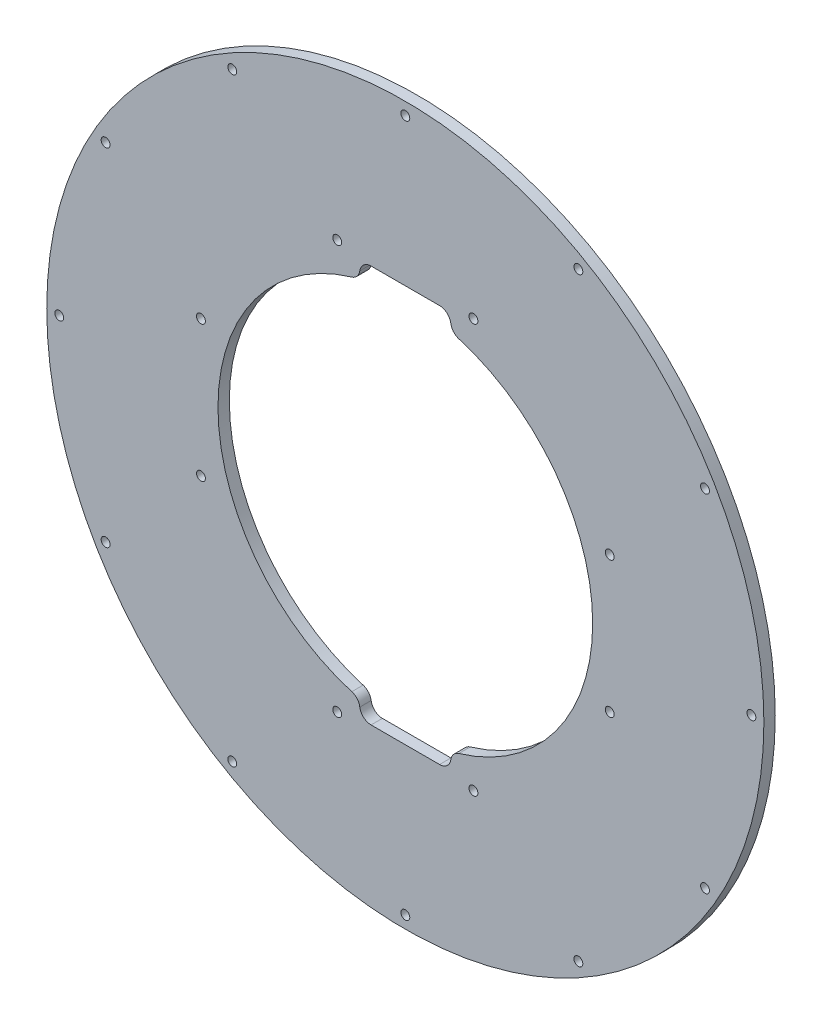
ISO-10303-21;
HEADER;
FILE_DESCRIPTION(('STEP AP214'),'2;1');
FILE_NAME('part.step','',(''),(''),'','','');
FILE_SCHEMA(('AUTOMOTIVE_DESIGN { 1 0 10303 214 1 1 1 1 }'));
ENDSEC;
DATA;
#1=APPLICATION_CONTEXT('core data for automotive mechanical design processes');
#2=APPLICATION_PROTOCOL_DEFINITION('international standard','automotive_design',2000,#1);
#3=PRODUCT_CONTEXT('',#1,'mechanical');
#4=PRODUCT('Part','Part','',(#3));
#5=PRODUCT_RELATED_PRODUCT_CATEGORY('part','',(#4));
#6=PRODUCT_DEFINITION_FORMATION('','',#4);
#7=PRODUCT_DEFINITION_CONTEXT('part definition',#1,'design');
#8=PRODUCT_DEFINITION('design','',#6,#7);
#9=PRODUCT_DEFINITION_SHAPE('','',#8);
#10=(LENGTH_UNIT() NAMED_UNIT(*) SI_UNIT(.MILLI.,.METRE.));
#11=(NAMED_UNIT(*) PLANE_ANGLE_UNIT() SI_UNIT($,.RADIAN.));
#12=(NAMED_UNIT(*) SI_UNIT($,.STERADIAN.) SOLID_ANGLE_UNIT());
#13=UNCERTAINTY_MEASURE_WITH_UNIT(LENGTH_MEASURE(1.E-05),#10,'distance_accuracy_value','');
#14=(GEOMETRIC_REPRESENTATION_CONTEXT(3) GLOBAL_UNCERTAINTY_ASSIGNED_CONTEXT((#13)) GLOBAL_UNIT_ASSIGNED_CONTEXT((#10,
#11,#12)) REPRESENTATION_CONTEXT('',''));
#15=CARTESIAN_POINT('',(0.,0.,0.));
#16=DIRECTION('',(0.,0.,1.));
#17=DIRECTION('',(1.,0.,0.));
#18=AXIS2_PLACEMENT_3D('',#15,#16,#17);
#19=CARTESIAN_POINT('',(0.,0.,6.35));
#20=DIRECTION('',(0.,0.,-1.));
#21=DIRECTION('',(-1.,0.,0.));
#22=AXIS2_PLACEMENT_3D('',#19,#20,#21);
#23=CYLINDRICAL_SURFACE('',#22,104.775);
#24=CARTESIAN_POINT('',(0.,0.,0.));
#25=DIRECTION('',(0.,0.,1.));
#26=DIRECTION('',(1.,0.,0.));
#27=AXIS2_PLACEMENT_3D('',#24,#25,#26);
#28=CIRCLE('',#27,104.775);
#29=CARTESIAN_POINT('',(29.9357142857136,-100.407438146803,0.));
#30=VERTEX_POINT('',#29);
#31=CARTESIAN_POINT('',(29.9357142857143,100.407438146803,0.));
#32=VERTEX_POINT('',#31);
#33=EDGE_CURVE('E139',#30,#32,#28,.T.);
#34=ORIENTED_EDGE('',*,*,#33,.F.);
#35=DIRECTION('',(0.,0.,-1.));
#36=VECTOR('',#35,1.);
#37=CARTESIAN_POINT('',(29.9357142857136,-100.407438146803,6.35));
#38=LINE('',#37,#36);
#39=CARTESIAN_POINT('',(29.9357142857136,-100.407438146803,6.35));
#40=VERTEX_POINT('',#39);
#41=EDGE_CURVE('E134',#30,#40,#38,.F.);
#42=ORIENTED_EDGE('',*,*,#41,.T.);
#43=CARTESIAN_POINT('',(0.,0.,6.35));
#44=DIRECTION('',(0.,0.,1.));
#45=DIRECTION('',(1.,0.,0.));
#46=AXIS2_PLACEMENT_3D('',#43,#44,#45);
#47=CIRCLE('',#46,104.775);
#48=CARTESIAN_POINT('',(29.9357142857143,100.407438146803,6.35));
#49=VERTEX_POINT('',#48);
#50=EDGE_CURVE('E136',#40,#49,#47,.T.);
#51=ORIENTED_EDGE('',*,*,#50,.T.);
#52=DIRECTION('',(0.,0.,-1.));
#53=VECTOR('',#52,1.);
#54=CARTESIAN_POINT('',(29.9357142857143,100.407438146803,6.35));
#55=LINE('',#54,#53);
#56=EDGE_CURVE('E145',#49,#32,#55,.T.);
#57=ORIENTED_EDGE('',*,*,#56,.T.);
#58=EDGE_LOOP('',(#34,#42,#51,#57));
#59=FACE_BOUND('',#58,.T.);
#60=ADVANCED_FACE('F44',(#59),#23,.F.);
#61=CARTESIAN_POINT('',(0.,0.,6.35));
#62=DIRECTION('',(0.,0.,1.));
#63=DIRECTION('',(1.,0.,0.));
#64=AXIS2_PLACEMENT_3D('',#61,#62,#63);
#65=PLANE('',#64);
#66=CARTESIAN_POINT('',(-114.3,38.1000000000012,6.35));
#67=DIRECTION('',(0.,0.,1.));
#68=DIRECTION('',(1.,0.,0.));
#69=AXIS2_PLACEMENT_3D('',#66,#67,#68);
#70=CIRCLE('',#69,2.48919999999998);
#71=CARTESIAN_POINT('',(-111.8108,38.1000000000012,6.35));
#72=VERTEX_POINT('',#71);
#73=EDGE_CURVE('E759',#72,#72,#70,.T.);
#74=ORIENTED_EDGE('',*,*,#73,.F.);
#75=EDGE_LOOP('',(#74));
#76=FACE_BOUND('',#75,.T.);
#77=CARTESIAN_POINT('',(-114.3,-38.0999999999988,6.35));
#78=DIRECTION('',(0.,0.,1.));
#79=DIRECTION('',(1.,0.,0.));
#80=AXIS2_PLACEMENT_3D('',#77,#78,#79);
#81=CIRCLE('',#80,2.48919999999998);
#82=CARTESIAN_POINT('',(-111.8108,-38.0999999999988,6.35));
#83=VERTEX_POINT('',#82);
#84=EDGE_CURVE('E752',#83,#83,#81,.T.);
#85=ORIENTED_EDGE('',*,*,#84,.F.);
#86=EDGE_LOOP('',(#85));
#87=FACE_BOUND('',#86,.T.);
#88=CARTESIAN_POINT('',(-38.1000000000008,-114.3,6.35));
#89=DIRECTION('',(0.,0.,1.));
#90=DIRECTION('',(1.,0.,0.));
#91=AXIS2_PLACEMENT_3D('',#88,#89,#90);
#92=CIRCLE('',#91,2.48919999999999);
#93=CARTESIAN_POINT('',(-35.6108000000008,-114.3,6.35));
#94=VERTEX_POINT('',#93);
#95=EDGE_CURVE('E744',#94,#94,#92,.T.);
#96=ORIENTED_EDGE('',*,*,#95,.F.);
#97=EDGE_LOOP('',(#96));
#98=FACE_BOUND('',#97,.T.);
#99=CARTESIAN_POINT('',(38.0999999999992,-114.3,6.35));
#100=DIRECTION('',(0.,0.,1.));
#101=DIRECTION('',(1.,0.,0.));
#102=AXIS2_PLACEMENT_3D('',#99,#100,#101);
#103=CIRCLE('',#102,2.48919999999999);
#104=CARTESIAN_POINT('',(40.5891999999992,-114.3,6.35));
#105=VERTEX_POINT('',#104);
#106=EDGE_CURVE('E736',#105,#105,#103,.T.);
#107=ORIENTED_EDGE('',*,*,#106,.F.);
#108=EDGE_LOOP('',(#107));
#109=FACE_BOUND('',#108,.T.);
#110=CARTESIAN_POINT('',(114.3,-38.1000000000004,6.35));
#111=DIRECTION('',(0.,0.,1.));
#112=DIRECTION('',(1.,0.,0.));
#113=AXIS2_PLACEMENT_3D('',#110,#111,#112);
#114=CIRCLE('',#113,2.48919999999998);
#115=CARTESIAN_POINT('',(116.7892,-38.1000000000004,6.35));
#116=VERTEX_POINT('',#115);
#117=EDGE_CURVE('E728',#116,#116,#114,.T.);
#118=ORIENTED_EDGE('',*,*,#117,.F.);
#119=EDGE_LOOP('',(#118));
#120=FACE_BOUND('',#119,.T.);
#121=CARTESIAN_POINT('',(114.3,38.0999999999996,6.35));
#122=DIRECTION('',(0.,0.,1.));
#123=DIRECTION('',(1.,0.,0.));
#124=AXIS2_PLACEMENT_3D('',#121,#122,#123);
#125=CIRCLE('',#124,2.48919999999998);
#126=CARTESIAN_POINT('',(116.7892,38.0999999999996,6.35));
#127=VERTEX_POINT('',#126);
#128=EDGE_CURVE('E720',#127,#127,#125,.T.);
#129=ORIENTED_EDGE('',*,*,#128,.F.);
#130=EDGE_LOOP('',(#129));
#131=FACE_BOUND('',#130,.T.);
#132=CARTESIAN_POINT('',(38.1,114.3,6.35));
#133=DIRECTION('',(0.,0.,1.));
#134=DIRECTION('',(1.,0.,0.));
#135=AXIS2_PLACEMENT_3D('',#132,#133,#134);
#136=CIRCLE('',#135,2.48919999999999);
#137=CARTESIAN_POINT('',(40.5892,114.3,6.35));
#138=VERTEX_POINT('',#137);
#139=EDGE_CURVE('E712',#138,#138,#136,.T.);
#140=ORIENTED_EDGE('',*,*,#139,.F.);
#141=EDGE_LOOP('',(#140));
#142=FACE_BOUND('',#141,.T.);
#143=CARTESIAN_POINT('',(-38.1,114.3,6.35));
#144=DIRECTION('',(0.,0.,1.));
#145=DIRECTION('',(1.,0.,0.));
#146=AXIS2_PLACEMENT_3D('',#143,#144,#145);
#147=CIRCLE('',#146,2.48919999999999);
#148=CARTESIAN_POINT('',(-35.6108,114.3,6.35));
#149=VERTEX_POINT('',#148);
#150=EDGE_CURVE('E704',#149,#149,#147,.T.);
#151=ORIENTED_EDGE('',*,*,#150,.F.);
#152=EDGE_LOOP('',(#151));
#153=FACE_BOUND('',#152,.T.);
#154=DIRECTION('',(1.,0.,0.));
#155=VECTOR('',#154,1.);
#156=CARTESIAN_POINT('',(25.3999999999992,-111.125,6.35));
#157=LINE('',#156,#155);
#158=CARTESIAN_POINT('',(-19.1667024144321,-111.125,6.35));
#159=VERTEX_POINT('',#158);
#160=CARTESIAN_POINT('',(19.1667024144305,-111.125,6.35));
#161=VERTEX_POINT('',#160);
#162=EDGE_CURVE('E249',#159,#161,#157,.T.);
#163=ORIENTED_EDGE('',*,*,#162,.F.);
#164=CARTESIAN_POINT('',(-19.166702414432,-104.775,6.35));
#165=DIRECTION('',(0.,0.,1.));
#166=DIRECTION('',(1.,0.,0.));
#167=AXIS2_PLACEMENT_3D('',#164,#165,#166);
#168=CIRCLE('',#167,6.35);
#169=CARTESIAN_POINT('',(-25.4583512072164,-105.633868714214,6.35));
#170=VERTEX_POINT('',#169);
#171=EDGE_CURVE('E225',#159,#170,#168,.F.);
#172=ORIENTED_EDGE('',*,*,#171,.T.);
#173=CARTESIAN_POINT('',(-31.7500000000008,-106.492737428427,6.35));
#174=DIRECTION('',(0.,0.,1.));
#175=DIRECTION('',(1.,0.,0.));
#176=AXIS2_PLACEMENT_3D('',#173,#174,#175);
#177=CIRCLE('',#176,6.35);
#178=CARTESIAN_POINT('',(-29.935714285715,-100.407438146803,6.35));
#179=VERTEX_POINT('',#178);
#180=EDGE_CURVE('E163',#170,#179,#177,.T.);
#181=ORIENTED_EDGE('',*,*,#180,.T.);
#182=CARTESIAN_POINT('',(-29.9357142857143,100.407438146803,6.35));
#183=VERTEX_POINT('',#182);
#184=EDGE_CURVE('E156',#183,#179,#47,.T.);
#185=ORIENTED_EDGE('',*,*,#184,.F.);
#186=CARTESIAN_POINT('',(-31.75,106.492737428427,6.35));
#187=DIRECTION('',(0.,0.,1.));
#188=DIRECTION('',(1.,0.,0.));
#189=AXIS2_PLACEMENT_3D('',#186,#187,#188);
#190=CIRCLE('',#189,6.35);
#191=CARTESIAN_POINT('',(-25.4583512072157,105.633868714214,6.35));
#192=VERTEX_POINT('',#191);
#193=EDGE_CURVE('E169',#183,#192,#190,.T.);
#194=ORIENTED_EDGE('',*,*,#193,.T.);
#195=CARTESIAN_POINT('',(-19.1667024144313,104.775,6.35));
#196=DIRECTION('',(0.,0.,1.));
#197=DIRECTION('',(1.,0.,0.));
#198=AXIS2_PLACEMENT_3D('',#195,#196,#197);
#199=CIRCLE('',#198,6.35);
#200=CARTESIAN_POINT('',(-19.1667024144313,111.125,6.35));
#201=VERTEX_POINT('',#200);
#202=EDGE_CURVE('E53',#192,#201,#199,.F.);
#203=ORIENTED_EDGE('',*,*,#202,.T.);
#204=DIRECTION('',(-1.,0.,0.));
#205=VECTOR('',#204,1.);
#206=CARTESIAN_POINT('',(-25.4,111.125,6.35));
#207=LINE('',#206,#205);
#208=CARTESIAN_POINT('',(19.1667024144313,111.125,6.35));
#209=VERTEX_POINT('',#208);
#210=EDGE_CURVE('E240',#209,#201,#207,.T.);
#211=ORIENTED_EDGE('',*,*,#210,.F.);
#212=CARTESIAN_POINT('',(19.1667024144313,104.775,6.35));
#213=DIRECTION('',(0.,0.,1.));
#214=DIRECTION('',(1.,0.,0.));
#215=AXIS2_PLACEMENT_3D('',#212,#213,#214);
#216=CIRCLE('',#215,6.35);
#217=CARTESIAN_POINT('',(25.4583512072156,105.633868714214,6.35));
#218=VERTEX_POINT('',#217);
#219=EDGE_CURVE('E231',#209,#218,#216,.F.);
#220=ORIENTED_EDGE('',*,*,#219,.T.);
#221=CARTESIAN_POINT('',(31.75,106.492737428427,6.35));
#222=DIRECTION('',(0.,0.,1.));
#223=DIRECTION('',(1.,0.,0.));
#224=AXIS2_PLACEMENT_3D('',#221,#222,#223);
#225=CIRCLE('',#224,6.35);
#226=EDGE_CURVE('E154',#218,#49,#225,.T.);
#227=ORIENTED_EDGE('',*,*,#226,.T.);
#228=ORIENTED_EDGE('',*,*,#50,.F.);
#229=CARTESIAN_POINT('',(31.7499999999992,-106.492737428428,6.35));
#230=DIRECTION('',(0.,0.,1.));
#231=DIRECTION('',(1.,0.,0.));
#232=AXIS2_PLACEMENT_3D('',#229,#230,#231);
#233=CIRCLE('',#232,6.35);
#234=CARTESIAN_POINT('',(25.4583512072149,-105.633868714214,6.35));
#235=VERTEX_POINT('',#234);
#236=EDGE_CURVE('E152',#40,#235,#233,.T.);
#237=ORIENTED_EDGE('',*,*,#236,.T.);
#238=CARTESIAN_POINT('',(19.1667024144305,-104.775,6.35));
#239=DIRECTION('',(0.,0.,1.));
#240=DIRECTION('',(1.,0.,0.));
#241=AXIS2_PLACEMENT_3D('',#238,#239,#240);
#242=CIRCLE('',#241,6.35);
#243=EDGE_CURVE('E219',#235,#161,#242,.F.);
#244=ORIENTED_EDGE('',*,*,#243,.T.);
#245=EDGE_LOOP('',(#163,#172,#181,#185,#194,#203,#211,#220,#227,#228,#237,#244));
#246=FACE_BOUND('',#245,.T.);
#247=CARTESIAN_POINT('',(-96.774,167.617484851671,6.35));
#248=DIRECTION('',(0.,0.,1.));
#249=DIRECTION('',(1.,0.,0.));
#250=AXIS2_PLACEMENT_3D('',#247,#248,#249);
#251=CIRCLE('',#250,2.48919999999998);
#252=CARTESIAN_POINT('',(-94.2848000000001,167.617484851671,6.35));
#253=VERTEX_POINT('',#252);
#254=EDGE_CURVE('E300',#253,#253,#251,.T.);
#255=ORIENTED_EDGE('',*,*,#254,.F.);
#256=EDGE_LOOP('',(#255));
#257=FACE_BOUND('',#256,.T.);
#258=CARTESIAN_POINT('',(-167.617484851671,96.774,6.35));
#259=DIRECTION('',(0.,0.,1.));
#260=DIRECTION('',(1.,0.,0.));
#261=AXIS2_PLACEMENT_3D('',#258,#259,#260);
#262=CIRCLE('',#261,2.4892);
#263=CARTESIAN_POINT('',(-165.128284851671,96.774,6.35));
#264=VERTEX_POINT('',#263);
#265=EDGE_CURVE('E308',#264,#264,#262,.T.);
#266=ORIENTED_EDGE('',*,*,#265,.F.);
#267=EDGE_LOOP('',(#266));
#268=FACE_BOUND('',#267,.T.);
#269=CARTESIAN_POINT('',(-193.548,0.,6.35));
#270=DIRECTION('',(0.,0.,1.));
#271=DIRECTION('',(1.,0.,0.));
#272=AXIS2_PLACEMENT_3D('',#269,#270,#271);
#273=CIRCLE('',#272,2.4892);
#274=CARTESIAN_POINT('',(-191.0588,0.,6.35));
#275=VERTEX_POINT('',#274);
#276=EDGE_CURVE('E316',#275,#275,#273,.T.);
#277=ORIENTED_EDGE('',*,*,#276,.F.);
#278=EDGE_LOOP('',(#277));
#279=FACE_BOUND('',#278,.T.);
#280=CARTESIAN_POINT('',(-167.617484851671,-96.774,6.35));
#281=DIRECTION('',(0.,0.,1.));
#282=DIRECTION('',(1.,0.,0.));
#283=AXIS2_PLACEMENT_3D('',#280,#281,#282);
#284=CIRCLE('',#283,2.4892);
#285=CARTESIAN_POINT('',(-165.128284851671,-96.774,6.35));
#286=VERTEX_POINT('',#285);
#287=EDGE_CURVE('E324',#286,#286,#284,.T.);
#288=ORIENTED_EDGE('',*,*,#287,.F.);
#289=EDGE_LOOP('',(#288));
#290=FACE_BOUND('',#289,.T.);
#291=CARTESIAN_POINT('',(-96.774,-167.617484851671,6.35));
#292=DIRECTION('',(0.,0.,1.));
#293=DIRECTION('',(1.,0.,0.));
#294=AXIS2_PLACEMENT_3D('',#291,#292,#293);
#295=CIRCLE('',#294,2.48919999999998);
#296=CARTESIAN_POINT('',(-94.2848,-167.617484851671,6.35));
#297=VERTEX_POINT('',#296);
#298=EDGE_CURVE('E332',#297,#297,#295,.T.);
#299=ORIENTED_EDGE('',*,*,#298,.F.);
#300=EDGE_LOOP('',(#299));
#301=FACE_BOUND('',#300,.T.);
#302=CARTESIAN_POINT('',(0.,-193.548,6.35));
#303=DIRECTION('',(0.,0.,1.));
#304=DIRECTION('',(1.,0.,0.));
#305=AXIS2_PLACEMENT_3D('',#302,#303,#304);
#306=CIRCLE('',#305,2.48919999999999);
#307=CARTESIAN_POINT('',(2.48919999999996,-193.548,6.35));
#308=VERTEX_POINT('',#307);
#309=EDGE_CURVE('E340',#308,#308,#306,.T.);
#310=ORIENTED_EDGE('',*,*,#309,.F.);
#311=EDGE_LOOP('',(#310));
#312=FACE_BOUND('',#311,.T.);
#313=CARTESIAN_POINT('',(96.7740000000001,-167.61748485167,6.35));
#314=DIRECTION('',(0.,0.,1.));
#315=DIRECTION('',(1.,0.,0.));
#316=AXIS2_PLACEMENT_3D('',#313,#314,#315);
#317=CIRCLE('',#316,2.48919999999998);
#318=CARTESIAN_POINT('',(99.2632000000001,-167.61748485167,6.35));
#319=VERTEX_POINT('',#318);
#320=EDGE_CURVE('E348',#319,#319,#317,.T.);
#321=ORIENTED_EDGE('',*,*,#320,.F.);
#322=EDGE_LOOP('',(#321));
#323=FACE_BOUND('',#322,.T.);
#324=CARTESIAN_POINT('',(167.617484851671,-96.774,6.35));
#325=DIRECTION('',(0.,0.,1.));
#326=DIRECTION('',(1.,0.,0.));
#327=AXIS2_PLACEMENT_3D('',#324,#325,#326);
#328=CIRCLE('',#327,2.4892);
#329=CARTESIAN_POINT('',(170.106684851671,-96.774,6.35));
#330=VERTEX_POINT('',#329);
#331=EDGE_CURVE('E356',#330,#330,#328,.T.);
#332=ORIENTED_EDGE('',*,*,#331,.F.);
#333=EDGE_LOOP('',(#332));
#334=FACE_BOUND('',#333,.T.);
#335=CARTESIAN_POINT('',(193.548,0.,6.35));
#336=DIRECTION('',(0.,0.,1.));
#337=DIRECTION('',(1.,0.,0.));
#338=AXIS2_PLACEMENT_3D('',#335,#336,#337);
#339=CIRCLE('',#338,2.4892);
#340=CARTESIAN_POINT('',(196.0372,0.,6.35));
#341=VERTEX_POINT('',#340);
#342=EDGE_CURVE('E364',#341,#341,#339,.T.);
#343=ORIENTED_EDGE('',*,*,#342,.F.);
#344=EDGE_LOOP('',(#343));
#345=FACE_BOUND('',#344,.T.);
#346=CARTESIAN_POINT('',(167.617484851671,96.7740000000001,6.35));
#347=DIRECTION('',(0.,0.,1.));
#348=DIRECTION('',(1.,0.,0.));
#349=AXIS2_PLACEMENT_3D('',#346,#347,#348);
#350=CIRCLE('',#349,2.4892);
#351=CARTESIAN_POINT('',(170.106684851671,96.7740000000001,6.35));
#352=VERTEX_POINT('',#351);
#353=EDGE_CURVE('E372',#352,#352,#350,.T.);
#354=ORIENTED_EDGE('',*,*,#353,.F.);
#355=EDGE_LOOP('',(#354));
#356=FACE_BOUND('',#355,.T.);
#357=CARTESIAN_POINT('',(96.774,167.617484851671,6.35));
#358=DIRECTION('',(0.,0.,1.));
#359=DIRECTION('',(1.,0.,0.));
#360=AXIS2_PLACEMENT_3D('',#357,#358,#359);
#361=CIRCLE('',#360,2.48919999999998);
#362=CARTESIAN_POINT('',(99.2632,167.617484851671,6.35));
#363=VERTEX_POINT('',#362);
#364=EDGE_CURVE('E380',#363,#363,#361,.T.);
#365=ORIENTED_EDGE('',*,*,#364,.F.);
#366=EDGE_LOOP('',(#365));
#367=FACE_BOUND('',#366,.T.);
#368=CARTESIAN_POINT('',(0.,193.548,6.35));
#369=DIRECTION('',(0.,0.,1.));
#370=DIRECTION('',(1.,0.,0.));
#371=AXIS2_PLACEMENT_3D('',#368,#369,#370);
#372=CIRCLE('',#371,2.48919999999999);
#373=CARTESIAN_POINT('',(2.48919999999993,193.548,6.35));
#374=VERTEX_POINT('',#373);
#375=EDGE_CURVE('E388',#374,#374,#372,.T.);
#376=ORIENTED_EDGE('',*,*,#375,.F.);
#377=EDGE_LOOP('',(#376));
#378=FACE_BOUND('',#377,.T.);
#379=CARTESIAN_POINT('',(0.,0.,6.35));
#380=DIRECTION('',(0.,0.,1.));
#381=DIRECTION('',(1.,0.,0.));
#382=AXIS2_PLACEMENT_3D('',#379,#380,#381);
#383=CIRCLE('',#382,200.533);
#384=CARTESIAN_POINT('',(200.533,0.,6.35));
#385=VERTEX_POINT('',#384);
#386=EDGE_CURVE('E269',#385,#385,#383,.T.);
#387=ORIENTED_EDGE('',*,*,#386,.T.);
#388=EDGE_LOOP('',(#387));
#389=FACE_BOUND('',#388,.T.);
#390=ADVANCED_FACE('F150',(#76,#87,#98,#109,#120,#131,#142,#153,#246,#257,#268,#279,#290,#301,
#312,#323,#334,#345,#356,#367,#378,#389),#65,.T.);
#391=CARTESIAN_POINT('',(0.,0.,0.));
#392=DIRECTION('',(0.,0.,1.));
#393=DIRECTION('',(1.,0.,0.));
#394=AXIS2_PLACEMENT_3D('',#391,#392,#393);
#395=PLANE('',#394);
#396=CARTESIAN_POINT('',(-114.3,38.1000000000012,0.));
#397=DIRECTION('',(0.,0.,1.));
#398=DIRECTION('',(1.,0.,0.));
#399=AXIS2_PLACEMENT_3D('',#396,#397,#398);
#400=CIRCLE('',#399,2.4892);
#401=CARTESIAN_POINT('',(-111.8108,38.1000000000012,0.));
#402=VERTEX_POINT('',#401);
#403=EDGE_CURVE('E756',#402,#402,#400,.T.);
#404=ORIENTED_EDGE('',*,*,#403,.T.);
#405=EDGE_LOOP('',(#404));
#406=FACE_BOUND('',#405,.T.);
#407=CARTESIAN_POINT('',(-114.3,-38.0999999999988,0.));
#408=DIRECTION('',(0.,0.,1.));
#409=DIRECTION('',(1.,0.,0.));
#410=AXIS2_PLACEMENT_3D('',#407,#408,#409);
#411=CIRCLE('',#410,2.4892);
#412=CARTESIAN_POINT('',(-111.8108,-38.0999999999988,0.));
#413=VERTEX_POINT('',#412);
#414=EDGE_CURVE('E748',#413,#413,#411,.T.);
#415=ORIENTED_EDGE('',*,*,#414,.T.);
#416=EDGE_LOOP('',(#415));
#417=FACE_BOUND('',#416,.T.);
#418=CARTESIAN_POINT('',(-38.1000000000008,-114.3,0.));
#419=DIRECTION('',(0.,0.,1.));
#420=DIRECTION('',(1.,0.,0.));
#421=AXIS2_PLACEMENT_3D('',#418,#419,#420);
#422=CIRCLE('',#421,2.4892);
#423=CARTESIAN_POINT('',(-35.6108000000008,-114.3,0.));
#424=VERTEX_POINT('',#423);
#425=EDGE_CURVE('E740',#424,#424,#422,.T.);
#426=ORIENTED_EDGE('',*,*,#425,.T.);
#427=EDGE_LOOP('',(#426));
#428=FACE_BOUND('',#427,.T.);
#429=CARTESIAN_POINT('',(38.0999999999992,-114.3,0.));
#430=DIRECTION('',(0.,0.,1.));
#431=DIRECTION('',(1.,0.,0.));
#432=AXIS2_PLACEMENT_3D('',#429,#430,#431);
#433=CIRCLE('',#432,2.4892);
#434=CARTESIAN_POINT('',(40.5891999999992,-114.3,0.));
#435=VERTEX_POINT('',#434);
#436=EDGE_CURVE('E732',#435,#435,#433,.T.);
#437=ORIENTED_EDGE('',*,*,#436,.T.);
#438=EDGE_LOOP('',(#437));
#439=FACE_BOUND('',#438,.T.);
#440=CARTESIAN_POINT('',(114.3,-38.1000000000004,0.));
#441=DIRECTION('',(0.,0.,1.));
#442=DIRECTION('',(1.,0.,0.));
#443=AXIS2_PLACEMENT_3D('',#440,#441,#442);
#444=CIRCLE('',#443,2.4892);
#445=CARTESIAN_POINT('',(116.7892,-38.1000000000004,0.));
#446=VERTEX_POINT('',#445);
#447=EDGE_CURVE('E724',#446,#446,#444,.T.);
#448=ORIENTED_EDGE('',*,*,#447,.T.);
#449=EDGE_LOOP('',(#448));
#450=FACE_BOUND('',#449,.T.);
#451=CARTESIAN_POINT('',(114.3,38.0999999999996,0.));
#452=DIRECTION('',(0.,0.,1.));
#453=DIRECTION('',(1.,0.,0.));
#454=AXIS2_PLACEMENT_3D('',#451,#452,#453);
#455=CIRCLE('',#454,2.4892);
#456=CARTESIAN_POINT('',(116.7892,38.0999999999996,0.));
#457=VERTEX_POINT('',#456);
#458=EDGE_CURVE('E716',#457,#457,#455,.T.);
#459=ORIENTED_EDGE('',*,*,#458,.T.);
#460=EDGE_LOOP('',(#459));
#461=FACE_BOUND('',#460,.T.);
#462=CARTESIAN_POINT('',(38.1,114.3,0.));
#463=DIRECTION('',(0.,0.,1.));
#464=DIRECTION('',(1.,0.,0.));
#465=AXIS2_PLACEMENT_3D('',#462,#463,#464);
#466=CIRCLE('',#465,2.4892);
#467=CARTESIAN_POINT('',(40.5892,114.3,0.));
#468=VERTEX_POINT('',#467);
#469=EDGE_CURVE('E708',#468,#468,#466,.T.);
#470=ORIENTED_EDGE('',*,*,#469,.T.);
#471=EDGE_LOOP('',(#470));
#472=FACE_BOUND('',#471,.T.);
#473=CARTESIAN_POINT('',(-38.1,114.3,0.));
#474=DIRECTION('',(0.,0.,1.));
#475=DIRECTION('',(1.,0.,0.));
#476=AXIS2_PLACEMENT_3D('',#473,#474,#475);
#477=CIRCLE('',#476,2.4892);
#478=CARTESIAN_POINT('',(-35.6108,114.3,0.));
#479=VERTEX_POINT('',#478);
#480=EDGE_CURVE('E296',#479,#479,#477,.T.);
#481=ORIENTED_EDGE('',*,*,#480,.T.);
#482=EDGE_LOOP('',(#481));
#483=FACE_BOUND('',#482,.T.);
#484=CARTESIAN_POINT('',(-29.9357142857143,100.407438146803,0.));
#485=VERTEX_POINT('',#484);
#486=CARTESIAN_POINT('',(-29.935714285715,-100.407438146803,0.));
#487=VERTEX_POINT('',#486);
#488=EDGE_CURVE('E157',#485,#487,#28,.T.);
#489=ORIENTED_EDGE('',*,*,#488,.T.);
#490=CARTESIAN_POINT('',(-31.7500000000008,-106.492737428427,0.));
#491=DIRECTION('',(0.,0.,1.));
#492=DIRECTION('',(1.,0.,0.));
#493=AXIS2_PLACEMENT_3D('',#490,#491,#492);
#494=CIRCLE('',#493,6.35);
#495=CARTESIAN_POINT('',(-25.4583512072164,-105.633868714214,0.));
#496=VERTEX_POINT('',#495);
#497=EDGE_CURVE('E188',#487,#496,#494,.F.);
#498=ORIENTED_EDGE('',*,*,#497,.T.);
#499=CARTESIAN_POINT('',(-19.166702414432,-104.775,0.));
#500=DIRECTION('',(0.,0.,1.));
#501=DIRECTION('',(1.,0.,0.));
#502=AXIS2_PLACEMENT_3D('',#499,#500,#501);
#503=CIRCLE('',#502,6.35);
#504=CARTESIAN_POINT('',(-19.1667024144321,-111.125,0.));
#505=VERTEX_POINT('',#504);
#506=EDGE_CURVE('E228',#496,#505,#503,.T.);
#507=ORIENTED_EDGE('',*,*,#506,.T.);
#508=DIRECTION('',(1.,0.,0.));
#509=VECTOR('',#508,1.);
#510=CARTESIAN_POINT('',(25.3999999999992,-111.125,0.));
#511=LINE('',#510,#509);
#512=CARTESIAN_POINT('',(19.1667024144305,-111.125,0.));
#513=VERTEX_POINT('',#512);
#514=EDGE_CURVE('E292',#505,#513,#511,.T.);
#515=ORIENTED_EDGE('',*,*,#514,.T.);
#516=CARTESIAN_POINT('',(19.1667024144305,-104.775,0.));
#517=DIRECTION('',(0.,0.,1.));
#518=DIRECTION('',(1.,0.,0.));
#519=AXIS2_PLACEMENT_3D('',#516,#517,#518);
#520=CIRCLE('',#519,6.35);
#521=CARTESIAN_POINT('',(25.4583512072149,-105.633868714214,0.));
#522=VERTEX_POINT('',#521);
#523=EDGE_CURVE('E222',#513,#522,#520,.T.);
#524=ORIENTED_EDGE('',*,*,#523,.T.);
#525=CARTESIAN_POINT('',(31.7499999999992,-106.492737428428,0.));
#526=DIRECTION('',(0.,0.,1.));
#527=DIRECTION('',(1.,0.,0.));
#528=AXIS2_PLACEMENT_3D('',#525,#526,#527);
#529=CIRCLE('',#528,6.35);
#530=EDGE_CURVE('E185',#522,#30,#529,.F.);
#531=ORIENTED_EDGE('',*,*,#530,.T.);
#532=ORIENTED_EDGE('',*,*,#33,.T.);
#533=CARTESIAN_POINT('',(31.75,106.492737428427,0.));
#534=DIRECTION('',(0.,0.,1.));
#535=DIRECTION('',(1.,0.,0.));
#536=AXIS2_PLACEMENT_3D('',#533,#534,#535);
#537=CIRCLE('',#536,6.35);
#538=CARTESIAN_POINT('',(25.4583512072156,105.633868714214,0.));
#539=VERTEX_POINT('',#538);
#540=EDGE_CURVE('E181',#32,#539,#537,.F.);
#541=ORIENTED_EDGE('',*,*,#540,.T.);
#542=CARTESIAN_POINT('',(19.1667024144313,104.775,0.));
#543=DIRECTION('',(0.,0.,1.));
#544=DIRECTION('',(1.,0.,0.));
#545=AXIS2_PLACEMENT_3D('',#542,#543,#544);
#546=CIRCLE('',#545,6.35);
#547=CARTESIAN_POINT('',(19.1667024144313,111.125,0.));
#548=VERTEX_POINT('',#547);
#549=EDGE_CURVE('E234',#539,#548,#546,.T.);
#550=ORIENTED_EDGE('',*,*,#549,.T.);
#551=DIRECTION('',(-1.,0.,0.));
#552=VECTOR('',#551,1.);
#553=CARTESIAN_POINT('',(-25.4,111.125,0.));
#554=LINE('',#553,#552);
#555=CARTESIAN_POINT('',(-19.1667024144313,111.125,0.));
#556=VERTEX_POINT('',#555);
#557=EDGE_CURVE('E248',#548,#556,#554,.T.);
#558=ORIENTED_EDGE('',*,*,#557,.T.);
#559=CARTESIAN_POINT('',(-19.1667024144313,104.775,0.));
#560=DIRECTION('',(0.,0.,1.));
#561=DIRECTION('',(1.,0.,0.));
#562=AXIS2_PLACEMENT_3D('',#559,#560,#561);
#563=CIRCLE('',#562,6.35);
#564=CARTESIAN_POINT('',(-25.4583512072157,105.633868714214,0.));
#565=VERTEX_POINT('',#564);
#566=EDGE_CURVE('E11',#556,#565,#563,.T.);
#567=ORIENTED_EDGE('',*,*,#566,.T.);
#568=CARTESIAN_POINT('',(-31.75,106.492737428427,0.));
#569=DIRECTION('',(0.,0.,1.));
#570=DIRECTION('',(1.,0.,0.));
#571=AXIS2_PLACEMENT_3D('',#568,#569,#570);
#572=CIRCLE('',#571,6.35);
#573=EDGE_CURVE('E178',#565,#485,#572,.F.);
#574=ORIENTED_EDGE('',*,*,#573,.T.);
#575=EDGE_LOOP('',(#489,#498,#507,#515,#524,#531,#532,#541,#550,#558,#567,#574));
#576=FACE_BOUND('',#575,.T.);
#577=CARTESIAN_POINT('',(-96.774,167.617484851671,0.));
#578=DIRECTION('',(0.,0.,1.));
#579=DIRECTION('',(1.,0.,0.));
#580=AXIS2_PLACEMENT_3D('',#577,#578,#579);
#581=CIRCLE('',#580,2.48919999999998);
#582=CARTESIAN_POINT('',(-94.2848000000001,167.617484851671,0.));
#583=VERTEX_POINT('',#582);
#584=EDGE_CURVE('E304',#583,#583,#581,.T.);
#585=ORIENTED_EDGE('',*,*,#584,.T.);
#586=EDGE_LOOP('',(#585));
#587=FACE_BOUND('',#586,.T.);
#588=CARTESIAN_POINT('',(-167.617484851671,96.774,0.));
#589=DIRECTION('',(0.,0.,1.));
#590=DIRECTION('',(1.,0.,0.));
#591=AXIS2_PLACEMENT_3D('',#588,#589,#590);
#592=CIRCLE('',#591,2.4892);
#593=CARTESIAN_POINT('',(-165.128284851671,96.774,0.));
#594=VERTEX_POINT('',#593);
#595=EDGE_CURVE('E312',#594,#594,#592,.T.);
#596=ORIENTED_EDGE('',*,*,#595,.T.);
#597=EDGE_LOOP('',(#596));
#598=FACE_BOUND('',#597,.T.);
#599=CARTESIAN_POINT('',(-193.548,0.,0.));
#600=DIRECTION('',(0.,0.,1.));
#601=DIRECTION('',(1.,0.,0.));
#602=AXIS2_PLACEMENT_3D('',#599,#600,#601);
#603=CIRCLE('',#602,2.4892);
#604=CARTESIAN_POINT('',(-191.0588,0.,0.));
#605=VERTEX_POINT('',#604);
#606=EDGE_CURVE('E320',#605,#605,#603,.T.);
#607=ORIENTED_EDGE('',*,*,#606,.T.);
#608=EDGE_LOOP('',(#607));
#609=FACE_BOUND('',#608,.T.);
#610=CARTESIAN_POINT('',(-167.617484851671,-96.774,0.));
#611=DIRECTION('',(0.,0.,1.));
#612=DIRECTION('',(1.,0.,0.));
#613=AXIS2_PLACEMENT_3D('',#610,#611,#612);
#614=CIRCLE('',#613,2.4892);
#615=CARTESIAN_POINT('',(-165.128284851671,-96.774,0.));
#616=VERTEX_POINT('',#615);
#617=EDGE_CURVE('E328',#616,#616,#614,.T.);
#618=ORIENTED_EDGE('',*,*,#617,.T.);
#619=EDGE_LOOP('',(#618));
#620=FACE_BOUND('',#619,.T.);
#621=CARTESIAN_POINT('',(-96.774,-167.617484851671,0.));
#622=DIRECTION('',(0.,0.,1.));
#623=DIRECTION('',(1.,0.,0.));
#624=AXIS2_PLACEMENT_3D('',#621,#622,#623);
#625=CIRCLE('',#624,2.48919999999998);
#626=CARTESIAN_POINT('',(-94.2848,-167.617484851671,0.));
#627=VERTEX_POINT('',#626);
#628=EDGE_CURVE('E336',#627,#627,#625,.T.);
#629=ORIENTED_EDGE('',*,*,#628,.T.);
#630=EDGE_LOOP('',(#629));
#631=FACE_BOUND('',#630,.T.);
#632=CARTESIAN_POINT('',(0.,-193.548,0.));
#633=DIRECTION('',(0.,0.,1.));
#634=DIRECTION('',(1.,0.,0.));
#635=AXIS2_PLACEMENT_3D('',#632,#633,#634);
#636=CIRCLE('',#635,2.48919999999999);
#637=CARTESIAN_POINT('',(2.48919999999996,-193.548,0.));
#638=VERTEX_POINT('',#637);
#639=EDGE_CURVE('E344',#638,#638,#636,.T.);
#640=ORIENTED_EDGE('',*,*,#639,.T.);
#641=EDGE_LOOP('',(#640));
#642=FACE_BOUND('',#641,.T.);
#643=CARTESIAN_POINT('',(96.7740000000001,-167.61748485167,0.));
#644=DIRECTION('',(0.,0.,1.));
#645=DIRECTION('',(1.,0.,0.));
#646=AXIS2_PLACEMENT_3D('',#643,#644,#645);
#647=CIRCLE('',#646,2.48919999999998);
#648=CARTESIAN_POINT('',(99.2632000000001,-167.61748485167,0.));
#649=VERTEX_POINT('',#648);
#650=EDGE_CURVE('E352',#649,#649,#647,.T.);
#651=ORIENTED_EDGE('',*,*,#650,.T.);
#652=EDGE_LOOP('',(#651));
#653=FACE_BOUND('',#652,.T.);
#654=CARTESIAN_POINT('',(167.617484851671,-96.774,0.));
#655=DIRECTION('',(0.,0.,1.));
#656=DIRECTION('',(1.,0.,0.));
#657=AXIS2_PLACEMENT_3D('',#654,#655,#656);
#658=CIRCLE('',#657,2.4892);
#659=CARTESIAN_POINT('',(170.106684851671,-96.774,0.));
#660=VERTEX_POINT('',#659);
#661=EDGE_CURVE('E360',#660,#660,#658,.T.);
#662=ORIENTED_EDGE('',*,*,#661,.T.);
#663=EDGE_LOOP('',(#662));
#664=FACE_BOUND('',#663,.T.);
#665=CARTESIAN_POINT('',(193.548,0.,0.));
#666=DIRECTION('',(0.,0.,1.));
#667=DIRECTION('',(1.,0.,0.));
#668=AXIS2_PLACEMENT_3D('',#665,#666,#667);
#669=CIRCLE('',#668,2.4892);
#670=CARTESIAN_POINT('',(196.0372,0.,0.));
#671=VERTEX_POINT('',#670);
#672=EDGE_CURVE('E368',#671,#671,#669,.T.);
#673=ORIENTED_EDGE('',*,*,#672,.T.);
#674=EDGE_LOOP('',(#673));
#675=FACE_BOUND('',#674,.T.);
#676=CARTESIAN_POINT('',(167.617484851671,96.7740000000001,0.));
#677=DIRECTION('',(0.,0.,1.));
#678=DIRECTION('',(1.,0.,0.));
#679=AXIS2_PLACEMENT_3D('',#676,#677,#678);
#680=CIRCLE('',#679,2.4892);
#681=CARTESIAN_POINT('',(170.106684851671,96.7740000000001,0.));
#682=VERTEX_POINT('',#681);
#683=EDGE_CURVE('E376',#682,#682,#680,.T.);
#684=ORIENTED_EDGE('',*,*,#683,.T.);
#685=EDGE_LOOP('',(#684));
#686=FACE_BOUND('',#685,.T.);
#687=CARTESIAN_POINT('',(96.774,167.617484851671,0.));
#688=DIRECTION('',(0.,0.,1.));
#689=DIRECTION('',(1.,0.,0.));
#690=AXIS2_PLACEMENT_3D('',#687,#688,#689);
#691=CIRCLE('',#690,2.48919999999998);
#692=CARTESIAN_POINT('',(99.2632,167.617484851671,0.));
#693=VERTEX_POINT('',#692);
#694=EDGE_CURVE('E384',#693,#693,#691,.T.);
#695=ORIENTED_EDGE('',*,*,#694,.T.);
#696=EDGE_LOOP('',(#695));
#697=FACE_BOUND('',#696,.T.);
#698=CARTESIAN_POINT('',(0.,193.548,0.));
#699=DIRECTION('',(0.,0.,1.));
#700=DIRECTION('',(1.,0.,0.));
#701=AXIS2_PLACEMENT_3D('',#698,#699,#700);
#702=CIRCLE('',#701,2.48919999999999);
#703=CARTESIAN_POINT('',(2.48919999999993,193.548,0.));
#704=VERTEX_POINT('',#703);
#705=EDGE_CURVE('E266',#704,#704,#702,.T.);
#706=ORIENTED_EDGE('',*,*,#705,.T.);
#707=EDGE_LOOP('',(#706));
#708=FACE_BOUND('',#707,.T.);
#709=CARTESIAN_POINT('',(0.,0.,0.));
#710=DIRECTION('',(0.,0.,1.));
#711=DIRECTION('',(1.,0.,0.));
#712=AXIS2_PLACEMENT_3D('',#709,#710,#711);
#713=CIRCLE('',#712,200.533);
#714=CARTESIAN_POINT('',(200.533,0.,0.));
#715=VERTEX_POINT('',#714);
#716=EDGE_CURVE('E273',#715,#715,#713,.T.);
#717=ORIENTED_EDGE('',*,*,#716,.F.);
#718=EDGE_LOOP('',(#717));
#719=FACE_BOUND('',#718,.T.);
#720=ADVANCED_FACE('F256',(#406,#417,#428,#439,#450,#461,#472,#483,#576,#587,#598,#609,#620,
#631,#642,#653,#664,#675,#686,#697,#708,#719),#395,.F.);
#721=CARTESIAN_POINT('',(0.,0.,6.35));
#722=DIRECTION('',(0.,0.,-1.));
#723=DIRECTION('',(-1.,0.,0.));
#724=AXIS2_PLACEMENT_3D('',#721,#722,#723);
#725=CYLINDRICAL_SURFACE('',#724,200.533);
#726=ORIENTED_EDGE('',*,*,#386,.F.);
#727=EDGE_LOOP('',(#726));
#728=FACE_BOUND('',#727,.T.);
#729=ORIENTED_EDGE('',*,*,#716,.T.);
#730=EDGE_LOOP('',(#729));
#731=FACE_BOUND('',#730,.T.);
#732=ADVANCED_FACE('F410',(#728,#731),#725,.T.);
#733=ORIENTED_EDGE('',*,*,#184,.T.);
#734=DIRECTION('',(0.,0.,-1.));
#735=VECTOR('',#734,1.);
#736=CARTESIAN_POINT('',(-29.935714285715,-100.407438146803,6.35));
#737=LINE('',#736,#735);
#738=EDGE_CURVE('E175',#179,#487,#737,.T.);
#739=ORIENTED_EDGE('',*,*,#738,.T.);
#740=ORIENTED_EDGE('',*,*,#488,.F.);
#741=DIRECTION('',(0.,0.,-1.));
#742=VECTOR('',#741,1.);
#743=CARTESIAN_POINT('',(-29.9357142857143,100.407438146803,6.35));
#744=LINE('',#743,#742);
#745=EDGE_CURVE('E167',#485,#183,#744,.F.);
#746=ORIENTED_EDGE('',*,*,#745,.T.);
#747=EDGE_LOOP('',(#733,#739,#740,#746));
#748=FACE_BOUND('',#747,.T.);
#749=ADVANCED_FACE('F261',(#748),#23,.F.);
#750=CARTESIAN_POINT('',(0.,193.548,6.35));
#751=DIRECTION('',(0.,0.,1.));
#752=DIRECTION('',(1.,0.,0.));
#753=AXIS2_PLACEMENT_3D('',#750,#751,#752);
#754=CYLINDRICAL_SURFACE('',#753,2.48919999999999);
#755=ORIENTED_EDGE('',*,*,#705,.F.);
#756=EDGE_LOOP('',(#755));
#757=FACE_BOUND('',#756,.T.);
#758=ORIENTED_EDGE('',*,*,#375,.T.);
#759=EDGE_LOOP('',(#758));
#760=FACE_BOUND('',#759,.T.);
#761=ADVANCED_FACE('F397',(#757,#760),#754,.F.);
#762=CARTESIAN_POINT('',(96.774,167.617484851671,6.35));
#763=DIRECTION('',(0.,0.,1.));
#764=DIRECTION('',(1.,0.,0.));
#765=AXIS2_PLACEMENT_3D('',#762,#763,#764);
#766=CYLINDRICAL_SURFACE('',#765,2.48919999999998);
#767=ORIENTED_EDGE('',*,*,#694,.F.);
#768=EDGE_LOOP('',(#767));
#769=FACE_BOUND('',#768,.T.);
#770=ORIENTED_EDGE('',*,*,#364,.T.);
#771=EDGE_LOOP('',(#770));
#772=FACE_BOUND('',#771,.T.);
#773=ADVANCED_FACE('F400',(#769,#772),#766,.F.);
#774=CARTESIAN_POINT('',(167.617484851671,96.7740000000001,6.35));
#775=DIRECTION('',(0.,0.,1.));
#776=DIRECTION('',(1.,0.,0.));
#777=AXIS2_PLACEMENT_3D('',#774,#775,#776);
#778=CYLINDRICAL_SURFACE('',#777,2.4892);
#779=ORIENTED_EDGE('',*,*,#683,.F.);
#780=EDGE_LOOP('',(#779));
#781=FACE_BOUND('',#780,.T.);
#782=ORIENTED_EDGE('',*,*,#353,.T.);
#783=EDGE_LOOP('',(#782));
#784=FACE_BOUND('',#783,.T.);
#785=ADVANCED_FACE('F459',(#781,#784),#778,.F.);
#786=CARTESIAN_POINT('',(193.548,0.,6.35));
#787=DIRECTION('',(0.,0.,1.));
#788=DIRECTION('',(1.,0.,0.));
#789=AXIS2_PLACEMENT_3D('',#786,#787,#788);
#790=CYLINDRICAL_SURFACE('',#789,2.4892);
#791=ORIENTED_EDGE('',*,*,#672,.F.);
#792=EDGE_LOOP('',(#791));
#793=FACE_BOUND('',#792,.T.);
#794=ORIENTED_EDGE('',*,*,#342,.T.);
#795=EDGE_LOOP('',(#794));
#796=FACE_BOUND('',#795,.T.);
#797=ADVANCED_FACE('F468',(#793,#796),#790,.F.);
#798=CARTESIAN_POINT('',(167.617484851671,-96.774,6.35));
#799=DIRECTION('',(0.,0.,1.));
#800=DIRECTION('',(1.,0.,0.));
#801=AXIS2_PLACEMENT_3D('',#798,#799,#800);
#802=CYLINDRICAL_SURFACE('',#801,2.4892);
#803=ORIENTED_EDGE('',*,*,#661,.F.);
#804=EDGE_LOOP('',(#803));
#805=FACE_BOUND('',#804,.T.);
#806=ORIENTED_EDGE('',*,*,#331,.T.);
#807=EDGE_LOOP('',(#806));
#808=FACE_BOUND('',#807,.T.);
#809=ADVANCED_FACE('F477',(#805,#808),#802,.F.);
#810=CARTESIAN_POINT('',(96.7740000000001,-167.61748485167,6.35));
#811=DIRECTION('',(0.,0.,1.));
#812=DIRECTION('',(1.,0.,0.));
#813=AXIS2_PLACEMENT_3D('',#810,#811,#812);
#814=CYLINDRICAL_SURFACE('',#813,2.48919999999998);
#815=ORIENTED_EDGE('',*,*,#650,.F.);
#816=EDGE_LOOP('',(#815));
#817=FACE_BOUND('',#816,.T.);
#818=ORIENTED_EDGE('',*,*,#320,.T.);
#819=EDGE_LOOP('',(#818));
#820=FACE_BOUND('',#819,.T.);
#821=ADVANCED_FACE('F486',(#817,#820),#814,.F.);
#822=CARTESIAN_POINT('',(0.,-193.548,6.35));
#823=DIRECTION('',(0.,0.,1.));
#824=DIRECTION('',(1.,0.,0.));
#825=AXIS2_PLACEMENT_3D('',#822,#823,#824);
#826=CYLINDRICAL_SURFACE('',#825,2.48919999999999);
#827=ORIENTED_EDGE('',*,*,#639,.F.);
#828=EDGE_LOOP('',(#827));
#829=FACE_BOUND('',#828,.T.);
#830=ORIENTED_EDGE('',*,*,#309,.T.);
#831=EDGE_LOOP('',(#830));
#832=FACE_BOUND('',#831,.T.);
#833=ADVANCED_FACE('F495',(#829,#832),#826,.F.);
#834=CARTESIAN_POINT('',(-96.774,-167.617484851671,6.35));
#835=DIRECTION('',(0.,0.,1.));
#836=DIRECTION('',(1.,0.,0.));
#837=AXIS2_PLACEMENT_3D('',#834,#835,#836);
#838=CYLINDRICAL_SURFACE('',#837,2.48919999999998);
#839=ORIENTED_EDGE('',*,*,#628,.F.);
#840=EDGE_LOOP('',(#839));
#841=FACE_BOUND('',#840,.T.);
#842=ORIENTED_EDGE('',*,*,#298,.T.);
#843=EDGE_LOOP('',(#842));
#844=FACE_BOUND('',#843,.T.);
#845=ADVANCED_FACE('F504',(#841,#844),#838,.F.);
#846=CARTESIAN_POINT('',(-167.617484851671,-96.774,6.35));
#847=DIRECTION('',(0.,0.,1.));
#848=DIRECTION('',(1.,0.,0.));
#849=AXIS2_PLACEMENT_3D('',#846,#847,#848);
#850=CYLINDRICAL_SURFACE('',#849,2.4892);
#851=ORIENTED_EDGE('',*,*,#617,.F.);
#852=EDGE_LOOP('',(#851));
#853=FACE_BOUND('',#852,.T.);
#854=ORIENTED_EDGE('',*,*,#287,.T.);
#855=EDGE_LOOP('',(#854));
#856=FACE_BOUND('',#855,.T.);
#857=ADVANCED_FACE('F513',(#853,#856),#850,.F.);
#858=CARTESIAN_POINT('',(-193.548,0.,6.35));
#859=DIRECTION('',(0.,0.,1.));
#860=DIRECTION('',(1.,0.,0.));
#861=AXIS2_PLACEMENT_3D('',#858,#859,#860);
#862=CYLINDRICAL_SURFACE('',#861,2.4892);
#863=ORIENTED_EDGE('',*,*,#606,.F.);
#864=EDGE_LOOP('',(#863));
#865=FACE_BOUND('',#864,.T.);
#866=ORIENTED_EDGE('',*,*,#276,.T.);
#867=EDGE_LOOP('',(#866));
#868=FACE_BOUND('',#867,.T.);
#869=ADVANCED_FACE('F522',(#865,#868),#862,.F.);
#870=CARTESIAN_POINT('',(-167.617484851671,96.774,6.35));
#871=DIRECTION('',(0.,0.,1.));
#872=DIRECTION('',(1.,0.,0.));
#873=AXIS2_PLACEMENT_3D('',#870,#871,#872);
#874=CYLINDRICAL_SURFACE('',#873,2.4892);
#875=ORIENTED_EDGE('',*,*,#595,.F.);
#876=EDGE_LOOP('',(#875));
#877=FACE_BOUND('',#876,.T.);
#878=ORIENTED_EDGE('',*,*,#265,.T.);
#879=EDGE_LOOP('',(#878));
#880=FACE_BOUND('',#879,.T.);
#881=ADVANCED_FACE('F531',(#877,#880),#874,.F.);
#882=CARTESIAN_POINT('',(-96.774,167.617484851671,6.35));
#883=DIRECTION('',(0.,0.,1.));
#884=DIRECTION('',(1.,0.,0.));
#885=AXIS2_PLACEMENT_3D('',#882,#883,#884);
#886=CYLINDRICAL_SURFACE('',#885,2.48919999999998);
#887=ORIENTED_EDGE('',*,*,#584,.F.);
#888=EDGE_LOOP('',(#887));
#889=FACE_BOUND('',#888,.T.);
#890=ORIENTED_EDGE('',*,*,#254,.T.);
#891=EDGE_LOOP('',(#890));
#892=FACE_BOUND('',#891,.T.);
#893=ADVANCED_FACE('F540',(#889,#892),#886,.F.);
#894=CARTESIAN_POINT('',(25.3999999999992,-111.125,0.));
#895=DIRECTION('',(0.,-1.,0.));
#896=DIRECTION('',(1.,0.,0.));
#897=AXIS2_PLACEMENT_3D('',#894,#895,#896);
#898=PLANE('',#897);
#899=ORIENTED_EDGE('',*,*,#162,.T.);
#900=DIRECTION('',(0.,0.,-1.));
#901=VECTOR('',#900,1.);
#902=CARTESIAN_POINT('',(19.1667024144305,-111.125,0.));
#903=LINE('',#902,#901);
#904=EDGE_CURVE('E200',#161,#513,#903,.T.);
#905=ORIENTED_EDGE('',*,*,#904,.T.);
#906=ORIENTED_EDGE('',*,*,#514,.F.);
#907=DIRECTION('',(0.,0.,-1.));
#908=VECTOR('',#907,1.);
#909=CARTESIAN_POINT('',(-19.1667024144321,-111.125,0.));
#910=LINE('',#909,#908);
#911=EDGE_CURVE('E196',#505,#159,#910,.F.);
#912=ORIENTED_EDGE('',*,*,#911,.T.);
#913=EDGE_LOOP('',(#899,#905,#906,#912));
#914=FACE_BOUND('',#913,.T.);
#915=ADVANCED_FACE('F290',(#914),#898,.F.);
#916=CARTESIAN_POINT('',(-25.4,111.125,0.));
#917=DIRECTION('',(0.,1.,0.));
#918=DIRECTION('',(0.,0.,1.));
#919=AXIS2_PLACEMENT_3D('',#916,#917,#918);
#920=PLANE('',#919);
#921=ORIENTED_EDGE('',*,*,#557,.F.);
#922=DIRECTION('',(0.,0.,-1.));
#923=VECTOR('',#922,1.);
#924=CARTESIAN_POINT('',(19.1667024144313,111.125,0.));
#925=LINE('',#924,#923);
#926=EDGE_CURVE('E209',#548,#209,#925,.F.);
#927=ORIENTED_EDGE('',*,*,#926,.T.);
#928=ORIENTED_EDGE('',*,*,#210,.T.);
#929=DIRECTION('',(0.,0.,-1.));
#930=VECTOR('',#929,1.);
#931=CARTESIAN_POINT('',(-19.1667024144313,111.125,0.));
#932=LINE('',#931,#930);
#933=EDGE_CURVE('E206',#201,#556,#932,.T.);
#934=ORIENTED_EDGE('',*,*,#933,.T.);
#935=EDGE_LOOP('',(#921,#927,#928,#934));
#936=FACE_BOUND('',#935,.T.);
#937=ADVANCED_FACE('F245',(#936),#920,.F.);
#938=CARTESIAN_POINT('',(-38.1,114.3,6.35));
#939=DIRECTION('',(0.,0.,1.));
#940=DIRECTION('',(1.,0.,0.));
#941=AXIS2_PLACEMENT_3D('',#938,#939,#940);
#942=CYLINDRICAL_SURFACE('',#941,2.48919999999999);
#943=ORIENTED_EDGE('',*,*,#480,.F.);
#944=EDGE_LOOP('',(#943));
#945=FACE_BOUND('',#944,.T.);
#946=ORIENTED_EDGE('',*,*,#150,.T.);
#947=EDGE_LOOP('',(#946));
#948=FACE_BOUND('',#947,.T.);
#949=ADVANCED_FACE('F555',(#945,#948),#942,.F.);
#950=CARTESIAN_POINT('',(38.1,114.3,6.35));
#951=DIRECTION('',(0.,0.,1.));
#952=DIRECTION('',(1.,0.,0.));
#953=AXIS2_PLACEMENT_3D('',#950,#951,#952);
#954=CYLINDRICAL_SURFACE('',#953,2.48919999999999);
#955=ORIENTED_EDGE('',*,*,#469,.F.);
#956=EDGE_LOOP('',(#955));
#957=FACE_BOUND('',#956,.T.);
#958=ORIENTED_EDGE('',*,*,#139,.T.);
#959=EDGE_LOOP('',(#958));
#960=FACE_BOUND('',#959,.T.);
#961=ADVANCED_FACE('F559',(#957,#960),#954,.F.);
#962=CARTESIAN_POINT('',(114.3,38.0999999999996,6.35));
#963=DIRECTION('',(0.,0.,1.));
#964=DIRECTION('',(1.,0.,0.));
#965=AXIS2_PLACEMENT_3D('',#962,#963,#964);
#966=CYLINDRICAL_SURFACE('',#965,2.48919999999999);
#967=ORIENTED_EDGE('',*,*,#458,.F.);
#968=EDGE_LOOP('',(#967));
#969=FACE_BOUND('',#968,.T.);
#970=ORIENTED_EDGE('',*,*,#128,.T.);
#971=EDGE_LOOP('',(#970));
#972=FACE_BOUND('',#971,.T.);
#973=ADVANCED_FACE('F569',(#969,#972),#966,.F.);
#974=CARTESIAN_POINT('',(114.3,-38.1000000000004,6.35));
#975=DIRECTION('',(0.,0.,1.));
#976=DIRECTION('',(1.,0.,0.));
#977=AXIS2_PLACEMENT_3D('',#974,#975,#976);
#978=CYLINDRICAL_SURFACE('',#977,2.48919999999999);
#979=ORIENTED_EDGE('',*,*,#447,.F.);
#980=EDGE_LOOP('',(#979));
#981=FACE_BOUND('',#980,.T.);
#982=ORIENTED_EDGE('',*,*,#117,.T.);
#983=EDGE_LOOP('',(#982));
#984=FACE_BOUND('',#983,.T.);
#985=ADVANCED_FACE('F578',(#981,#984),#978,.F.);
#986=CARTESIAN_POINT('',(38.0999999999992,-114.3,6.35));
#987=DIRECTION('',(0.,0.,1.));
#988=DIRECTION('',(1.,0.,0.));
#989=AXIS2_PLACEMENT_3D('',#986,#987,#988);
#990=CYLINDRICAL_SURFACE('',#989,2.48919999999999);
#991=ORIENTED_EDGE('',*,*,#436,.F.);
#992=EDGE_LOOP('',(#991));
#993=FACE_BOUND('',#992,.T.);
#994=ORIENTED_EDGE('',*,*,#106,.T.);
#995=EDGE_LOOP('',(#994));
#996=FACE_BOUND('',#995,.T.);
#997=ADVANCED_FACE('F587',(#993,#996),#990,.F.);
#998=CARTESIAN_POINT('',(-38.1000000000008,-114.3,6.35));
#999=DIRECTION('',(0.,0.,1.));
#1000=DIRECTION('',(1.,0.,0.));
#1001=AXIS2_PLACEMENT_3D('',#998,#999,#1000);
#1002=CYLINDRICAL_SURFACE('',#1001,2.48919999999999);
#1003=ORIENTED_EDGE('',*,*,#425,.F.);
#1004=EDGE_LOOP('',(#1003));
#1005=FACE_BOUND('',#1004,.T.);
#1006=ORIENTED_EDGE('',*,*,#95,.T.);
#1007=EDGE_LOOP('',(#1006));
#1008=FACE_BOUND('',#1007,.T.);
#1009=ADVANCED_FACE('F596',(#1005,#1008),#1002,.F.);
#1010=CARTESIAN_POINT('',(-114.3,-38.0999999999988,6.35));
#1011=DIRECTION('',(0.,0.,1.));
#1012=DIRECTION('',(1.,0.,0.));
#1013=AXIS2_PLACEMENT_3D('',#1010,#1011,#1012);
#1014=CYLINDRICAL_SURFACE('',#1013,2.48919999999999);
#1015=ORIENTED_EDGE('',*,*,#414,.F.);
#1016=EDGE_LOOP('',(#1015));
#1017=FACE_BOUND('',#1016,.T.);
#1018=ORIENTED_EDGE('',*,*,#84,.T.);
#1019=EDGE_LOOP('',(#1018));
#1020=FACE_BOUND('',#1019,.T.);
#1021=ADVANCED_FACE('F605',(#1017,#1020),#1014,.F.);
#1022=CARTESIAN_POINT('',(-114.3,38.1000000000012,6.35));
#1023=DIRECTION('',(0.,0.,1.));
#1024=DIRECTION('',(1.,0.,0.));
#1025=AXIS2_PLACEMENT_3D('',#1022,#1023,#1024);
#1026=CYLINDRICAL_SURFACE('',#1025,2.48919999999999);
#1027=ORIENTED_EDGE('',*,*,#403,.F.);
#1028=EDGE_LOOP('',(#1027));
#1029=FACE_BOUND('',#1028,.T.);
#1030=ORIENTED_EDGE('',*,*,#73,.T.);
#1031=EDGE_LOOP('',(#1030));
#1032=FACE_BOUND('',#1031,.T.);
#1033=ADVANCED_FACE('F613',(#1029,#1032),#1026,.F.);
#1034=CARTESIAN_POINT('',(-31.7500000000008,-106.492737428427,6.35));
#1035=DIRECTION('',(0.,0.,-1.));
#1036=DIRECTION('',(-1.,0.,0.));
#1037=AXIS2_PLACEMENT_3D('',#1034,#1035,#1036);
#1038=CYLINDRICAL_SURFACE('',#1037,6.35);
#1039=ORIENTED_EDGE('',*,*,#180,.F.);
#1040=DIRECTION('',(0.,0.,-1.));
#1041=VECTOR('',#1040,1.);
#1042=CARTESIAN_POINT('',(-25.4583512072164,-105.633868714214,6.35));
#1043=LINE('',#1042,#1041);
#1044=EDGE_CURVE('E203',#170,#496,#1043,.T.);
#1045=ORIENTED_EDGE('',*,*,#1044,.T.);
#1046=ORIENTED_EDGE('',*,*,#497,.F.);
#1047=ORIENTED_EDGE('',*,*,#738,.F.);
#1048=EDGE_LOOP('',(#1039,#1045,#1046,#1047));
#1049=FACE_BOUND('',#1048,.T.);
#1050=ADVANCED_FACE('F280',(#1049),#1038,.T.);
#1051=CARTESIAN_POINT('',(31.7499999999992,-106.492737428428,6.35));
#1052=DIRECTION('',(0.,0.,-1.));
#1053=DIRECTION('',(-1.,0.,0.));
#1054=AXIS2_PLACEMENT_3D('',#1051,#1052,#1053);
#1055=CYLINDRICAL_SURFACE('',#1054,6.35);
#1056=ORIENTED_EDGE('',*,*,#530,.F.);
#1057=DIRECTION('',(0.,0.,-1.));
#1058=VECTOR('',#1057,1.);
#1059=CARTESIAN_POINT('',(25.4583512072149,-105.633868714214,6.35));
#1060=LINE('',#1059,#1058);
#1061=EDGE_CURVE('E144',#522,#235,#1060,.F.);
#1062=ORIENTED_EDGE('',*,*,#1061,.T.);
#1063=ORIENTED_EDGE('',*,*,#236,.F.);
#1064=ORIENTED_EDGE('',*,*,#41,.F.);
#1065=EDGE_LOOP('',(#1056,#1062,#1063,#1064));
#1066=FACE_BOUND('',#1065,.T.);
#1067=ADVANCED_FACE('F160',(#1066),#1055,.T.);
#1068=CARTESIAN_POINT('',(31.75,106.492737428427,6.35));
#1069=DIRECTION('',(0.,0.,-1.));
#1070=DIRECTION('',(-1.,0.,0.));
#1071=AXIS2_PLACEMENT_3D('',#1068,#1069,#1070);
#1072=CYLINDRICAL_SURFACE('',#1071,6.35);
#1073=ORIENTED_EDGE('',*,*,#226,.F.);
#1074=DIRECTION('',(0.,0.,-1.));
#1075=VECTOR('',#1074,1.);
#1076=CARTESIAN_POINT('',(25.4583512072156,105.633868714214,6.35));
#1077=LINE('',#1076,#1075);
#1078=EDGE_CURVE('E213',#218,#539,#1077,.T.);
#1079=ORIENTED_EDGE('',*,*,#1078,.T.);
#1080=ORIENTED_EDGE('',*,*,#540,.F.);
#1081=ORIENTED_EDGE('',*,*,#56,.F.);
#1082=EDGE_LOOP('',(#1073,#1079,#1080,#1081));
#1083=FACE_BOUND('',#1082,.T.);
#1084=ADVANCED_FACE('F642',(#1083),#1072,.T.);
#1085=CARTESIAN_POINT('',(-31.75,106.492737428427,6.35));
#1086=DIRECTION('',(0.,0.,-1.));
#1087=DIRECTION('',(-1.,0.,0.));
#1088=AXIS2_PLACEMENT_3D('',#1085,#1086,#1087);
#1089=CYLINDRICAL_SURFACE('',#1088,6.35);
#1090=ORIENTED_EDGE('',*,*,#573,.F.);
#1091=DIRECTION('',(0.,0.,-1.));
#1092=VECTOR('',#1091,1.);
#1093=CARTESIAN_POINT('',(-25.4583512072157,105.633868714214,6.35));
#1094=LINE('',#1093,#1092);
#1095=EDGE_CURVE('E216',#565,#192,#1094,.F.);
#1096=ORIENTED_EDGE('',*,*,#1095,.T.);
#1097=ORIENTED_EDGE('',*,*,#193,.F.);
#1098=ORIENTED_EDGE('',*,*,#745,.F.);
#1099=EDGE_LOOP('',(#1090,#1096,#1097,#1098));
#1100=FACE_BOUND('',#1099,.T.);
#1101=ADVANCED_FACE('F252',(#1100),#1089,.T.);
#1102=CARTESIAN_POINT('',(19.1667024144305,-104.775,6.35));
#1103=DIRECTION('',(0.,0.,-1.));
#1104=DIRECTION('',(-1.,0.,0.));
#1105=AXIS2_PLACEMENT_3D('',#1102,#1103,#1104);
#1106=CYLINDRICAL_SURFACE('',#1105,6.35);
#1107=ORIENTED_EDGE('',*,*,#523,.F.);
#1108=ORIENTED_EDGE('',*,*,#904,.F.);
#1109=ORIENTED_EDGE('',*,*,#243,.F.);
#1110=ORIENTED_EDGE('',*,*,#1061,.F.);
#1111=EDGE_LOOP('',(#1107,#1108,#1109,#1110));
#1112=FACE_BOUND('',#1111,.T.);
#1113=ADVANCED_FACE('F660',(#1112),#1106,.F.);
#1114=CARTESIAN_POINT('',(-19.166702414432,-104.775,6.35));
#1115=DIRECTION('',(0.,0.,-1.));
#1116=DIRECTION('',(-1.,0.,0.));
#1117=AXIS2_PLACEMENT_3D('',#1114,#1115,#1116);
#1118=CYLINDRICAL_SURFACE('',#1117,6.35);
#1119=ORIENTED_EDGE('',*,*,#506,.F.);
#1120=ORIENTED_EDGE('',*,*,#1044,.F.);
#1121=ORIENTED_EDGE('',*,*,#171,.F.);
#1122=ORIENTED_EDGE('',*,*,#911,.F.);
#1123=EDGE_LOOP('',(#1119,#1120,#1121,#1122));
#1124=FACE_BOUND('',#1123,.T.);
#1125=ADVANCED_FACE('F287',(#1124),#1118,.F.);
#1126=CARTESIAN_POINT('',(19.1667024144313,104.775,6.35));
#1127=DIRECTION('',(0.,0.,-1.));
#1128=DIRECTION('',(-1.,0.,0.));
#1129=AXIS2_PLACEMENT_3D('',#1126,#1127,#1128);
#1130=CYLINDRICAL_SURFACE('',#1129,6.35);
#1131=ORIENTED_EDGE('',*,*,#549,.F.);
#1132=ORIENTED_EDGE('',*,*,#1078,.F.);
#1133=ORIENTED_EDGE('',*,*,#219,.F.);
#1134=ORIENTED_EDGE('',*,*,#926,.F.);
#1135=EDGE_LOOP('',(#1131,#1132,#1133,#1134));
#1136=FACE_BOUND('',#1135,.T.);
#1137=ADVANCED_FACE('F678',(#1136),#1130,.F.);
#1138=CARTESIAN_POINT('',(-19.1667024144313,104.775,6.35));
#1139=DIRECTION('',(0.,0.,-1.));
#1140=DIRECTION('',(-1.,0.,0.));
#1141=AXIS2_PLACEMENT_3D('',#1138,#1139,#1140);
#1142=CYLINDRICAL_SURFACE('',#1141,6.35);
#1143=ORIENTED_EDGE('',*,*,#566,.F.);
#1144=ORIENTED_EDGE('',*,*,#933,.F.);
#1145=ORIENTED_EDGE('',*,*,#202,.F.);
#1146=ORIENTED_EDGE('',*,*,#1095,.F.);
#1147=EDGE_LOOP('',(#1143,#1144,#1145,#1146));
#1148=FACE_BOUND('',#1147,.T.);
#1149=ADVANCED_FACE('F46',(#1148),#1142,.F.);
#1150=CLOSED_SHELL('',(#60,#390,#720,#732,#749,#761,#773,#785,#797,#809,#821,#833,#845,#857,
#869,#881,#893,#915,#937,#949,#961,#973,#985,#997,#1009,#1021,#1033,#1050,#1067,#1084,#1101,
#1113,#1125,#1137,#1149));
#1151=MANIFOLD_SOLID_BREP('B2',#1150);
#1152=ADVANCED_BREP_SHAPE_REPRESENTATION('',(#18,#1151),#14);
#1153=SHAPE_DEFINITION_REPRESENTATION(#9,#1152);
ENDSEC;
END-ISO-10303-21;
